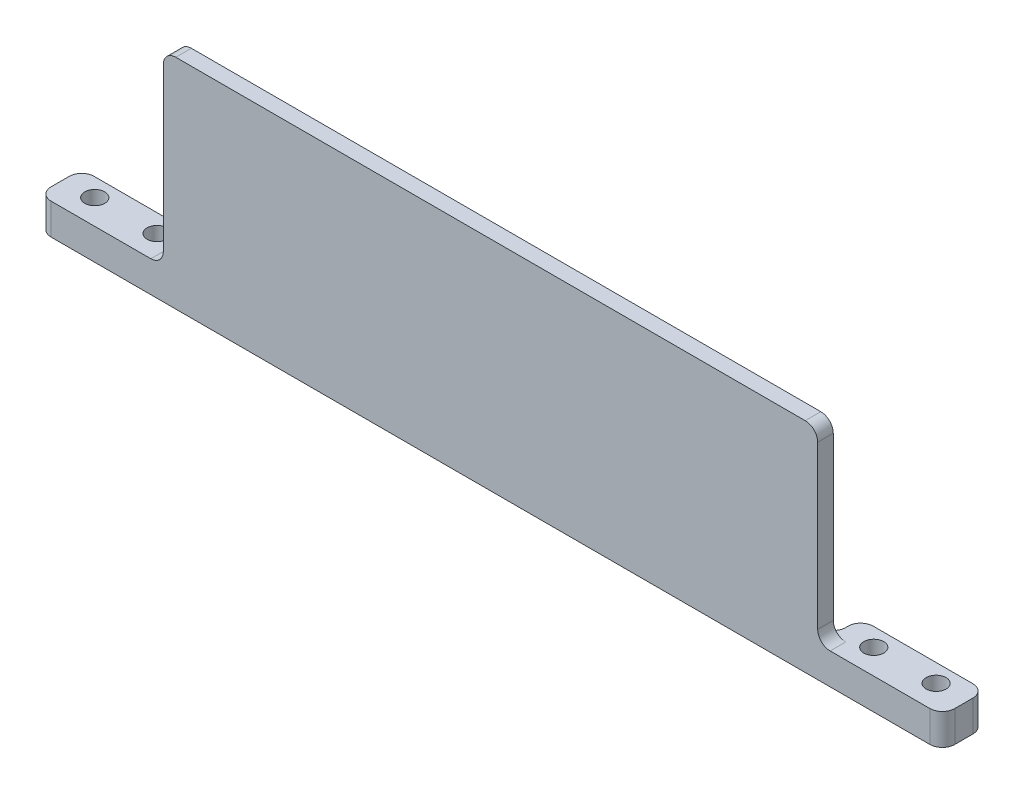
ISO-10303-21;
HEADER;
FILE_DESCRIPTION(('STEP AP214'),'2;1');
FILE_NAME('part.step','',(''),(''),'','','');
FILE_SCHEMA(('AUTOMOTIVE_DESIGN { 1 0 10303 214 1 1 1 1 }'));
ENDSEC;
DATA;
#1=APPLICATION_CONTEXT('core data for automotive mechanical design processes');
#2=APPLICATION_PROTOCOL_DEFINITION('international standard','automotive_design',2000,#1);
#3=PRODUCT_CONTEXT('',#1,'mechanical');
#4=PRODUCT('Part','Part','',(#3));
#5=PRODUCT_RELATED_PRODUCT_CATEGORY('part','',(#4));
#6=PRODUCT_DEFINITION_FORMATION('','',#4);
#7=PRODUCT_DEFINITION_CONTEXT('part definition',#1,'design');
#8=PRODUCT_DEFINITION('design','',#6,#7);
#9=PRODUCT_DEFINITION_SHAPE('','',#8);
#10=(LENGTH_UNIT() NAMED_UNIT(*) SI_UNIT(.MILLI.,.METRE.));
#11=(NAMED_UNIT(*) PLANE_ANGLE_UNIT() SI_UNIT($,.RADIAN.));
#12=(NAMED_UNIT(*) SI_UNIT($,.STERADIAN.) SOLID_ANGLE_UNIT());
#13=UNCERTAINTY_MEASURE_WITH_UNIT(LENGTH_MEASURE(1.E-05),#10,'distance_accuracy_value','');
#14=(GEOMETRIC_REPRESENTATION_CONTEXT(3) GLOBAL_UNCERTAINTY_ASSIGNED_CONTEXT((#13)) GLOBAL_UNIT_ASSIGNED_CONTEXT((#10,
#11,#12)) REPRESENTATION_CONTEXT('',''));
#15=CARTESIAN_POINT('',(0.,0.,0.));
#16=DIRECTION('',(0.,0.,1.));
#17=DIRECTION('',(1.,0.,0.));
#18=AXIS2_PLACEMENT_3D('',#15,#16,#17);
#19=CARTESIAN_POINT('',(0.,5.,0.));
#20=DIRECTION('',(0.,1.,0.));
#21=DIRECTION('',(0.,0.,1.));
#22=AXIS2_PLACEMENT_3D('',#19,#20,#21);
#23=PLANE('',#22);
#24=DIRECTION('',(-1.,0.,0.));
#25=VECTOR('',#24,1.);
#26=CARTESIAN_POINT('',(-52.5,5.,1.50000000000001));
#27=LINE('',#26,#25);
#28=CARTESIAN_POINT('',(54.5,5.,1.50000000000001));
#29=VERTEX_POINT('',#28);
#30=CARTESIAN_POINT('',(50.5,5.,1.50000000000001));
#31=VERTEX_POINT('',#30);
#32=EDGE_CURVE('E328',#29,#31,#27,.T.);
#33=ORIENTED_EDGE('',*,*,#32,.F.);
#34=DIRECTION('',(0.,0.,-1.));
#35=VECTOR('',#34,1.);
#36=CARTESIAN_POINT('',(54.5,5.,0.));
#37=LINE('',#36,#35);
#38=CARTESIAN_POINT('',(54.5,5.,4.00000000000001));
#39=VERTEX_POINT('',#38);
#40=EDGE_CURVE('E400',#29,#39,#37,.F.);
#41=ORIENTED_EDGE('',*,*,#40,.T.);
#42=DIRECTION('',(1.,0.,0.));
#43=VECTOR('',#42,1.);
#44=CARTESIAN_POINT('',(72.5,5.,4.00000000000001));
#45=LINE('',#44,#43);
#46=CARTESIAN_POINT('',(70.5,5.,4.00000000000001));
#47=VERTEX_POINT('',#46);
#48=EDGE_CURVE('E288',#39,#47,#45,.T.);
#49=ORIENTED_EDGE('',*,*,#48,.T.);
#50=CARTESIAN_POINT('',(70.5,5.,2.00000000000001));
#51=DIRECTION('',(0.,1.,0.));
#52=DIRECTION('',(0.,0.,1.));
#53=AXIS2_PLACEMENT_3D('',#50,#51,#52);
#54=CIRCLE('',#53,2.);
#55=CARTESIAN_POINT('',(72.5,5.,2.00000000000001));
#56=VERTEX_POINT('',#55);
#57=EDGE_CURVE('E357',#47,#56,#54,.T.);
#58=ORIENTED_EDGE('',*,*,#57,.T.);
#59=DIRECTION('',(0.,0.,-1.));
#60=VECTOR('',#59,1.);
#61=CARTESIAN_POINT('',(72.5,5.,4.00000000000001));
#62=LINE('',#61,#60);
#63=CARTESIAN_POINT('',(72.5,5.,-0.899999999999991));
#64=VERTEX_POINT('',#63);
#65=EDGE_CURVE('E269',#56,#64,#62,.T.);
#66=ORIENTED_EDGE('',*,*,#65,.T.);
#67=CARTESIAN_POINT('',(70.5,5.,-0.899999999999991));
#68=DIRECTION('',(0.,1.,0.));
#69=DIRECTION('',(0.,0.,1.));
#70=AXIS2_PLACEMENT_3D('',#67,#68,#69);
#71=CIRCLE('',#70,2.);
#72=CARTESIAN_POINT('',(70.5,5.,-2.89999999999999));
#73=VERTEX_POINT('',#72);
#74=EDGE_CURVE('E361',#64,#73,#71,.T.);
#75=ORIENTED_EDGE('',*,*,#74,.T.);
#76=DIRECTION('',(-1.,0.,0.));
#77=VECTOR('',#76,1.);
#78=CARTESIAN_POINT('',(72.5,5.,-2.89999999999999));
#79=LINE('',#78,#77);
#80=CARTESIAN_POINT('',(54.5,5.,-2.89999999999999));
#81=VERTEX_POINT('',#80);
#82=EDGE_CURVE('E272',#73,#81,#79,.T.);
#83=ORIENTED_EDGE('',*,*,#82,.T.);
#84=CARTESIAN_POINT('',(54.5,5.,-0.899999999999991));
#85=DIRECTION('',(0.,1.,0.));
#86=DIRECTION('',(0.,0.,1.));
#87=AXIS2_PLACEMENT_3D('',#84,#85,#86);
#88=CIRCLE('',#87,2.);
#89=CARTESIAN_POINT('',(52.5,5.,-0.899999999999991));
#90=VERTEX_POINT('',#89);
#91=EDGE_CURVE('E359',#81,#90,#88,.T.);
#92=ORIENTED_EDGE('',*,*,#91,.T.);
#93=DIRECTION('',(0.,0.,1.));
#94=VECTOR('',#93,1.);
#95=CARTESIAN_POINT('',(52.5,5.,-2.89999999999999));
#96=LINE('',#95,#94);
#97=CARTESIAN_POINT('',(52.5,5.,-0.499999999999993));
#98=VERTEX_POINT('',#97);
#99=EDGE_CURVE('E276',#90,#98,#96,.T.);
#100=ORIENTED_EDGE('',*,*,#99,.T.);
#101=CARTESIAN_POINT('',(50.5,5.,-0.499999999999993));
#102=DIRECTION('',(0.,1.,0.));
#103=DIRECTION('',(0.,0.,1.));
#104=AXIS2_PLACEMENT_3D('',#101,#102,#103);
#105=CIRCLE('',#104,2.);
#106=EDGE_CURVE('E391',#98,#31,#105,.F.);
#107=ORIENTED_EDGE('',*,*,#106,.T.);
#108=EDGE_LOOP('',(#33,#41,#49,#58,#66,#75,#83,#92,#100,#107));
#109=FACE_BOUND('',#108,.T.);
#110=CARTESIAN_POINT('',(57.5,5.,0.));
#111=DIRECTION('',(0.,1.,0.));
#112=DIRECTION('',(0.,0.,-1.));
#113=AXIS2_PLACEMENT_3D('',#110,#111,#112);
#114=CIRCLE('',#113,1.6);
#115=CARTESIAN_POINT('',(57.5,5.,-1.59999999999999));
#116=VERTEX_POINT('',#115);
#117=EDGE_CURVE('E245',#116,#116,#114,.T.);
#118=ORIENTED_EDGE('',*,*,#117,.F.);
#119=EDGE_LOOP('',(#118));
#120=FACE_BOUND('',#119,.T.);
#121=CARTESIAN_POINT('',(67.5,5.,0.));
#122=DIRECTION('',(0.,1.,0.));
#123=DIRECTION('',(0.,0.,-1.));
#124=AXIS2_PLACEMENT_3D('',#121,#122,#123);
#125=CIRCLE('',#124,1.60000000000001);
#126=CARTESIAN_POINT('',(67.5,5.,-1.6));
#127=VERTEX_POINT('',#126);
#128=EDGE_CURVE('E251',#127,#127,#125,.T.);
#129=ORIENTED_EDGE('',*,*,#128,.F.);
#130=EDGE_LOOP('',(#129));
#131=FACE_BOUND('',#130,.T.);
#132=ADVANCED_FACE('F44',(#109,#120,#131),#23,.T.);
#133=CARTESIAN_POINT('',(-70.5,5.,4.00000000000001));
#134=VERTEX_POINT('',#133);
#135=CARTESIAN_POINT('',(-54.5,5.,4.00000000000001));
#136=VERTEX_POINT('',#135);
#137=EDGE_CURVE('E226',#134,#136,#45,.T.);
#138=ORIENTED_EDGE('',*,*,#137,.T.);
#139=DIRECTION('',(0.,0.,1.));
#140=VECTOR('',#139,1.);
#141=CARTESIAN_POINT('',(-54.5,5.,0.));
#142=LINE('',#141,#140);
#143=CARTESIAN_POINT('',(-54.5,5.,1.50000000000001));
#144=VERTEX_POINT('',#143);
#145=EDGE_CURVE('E405',#136,#144,#142,.F.);
#146=ORIENTED_EDGE('',*,*,#145,.T.);
#147=DIRECTION('',(-1.,0.,0.));
#148=VECTOR('',#147,1.);
#149=CARTESIAN_POINT('',(-52.5,5.,1.50000000000001));
#150=LINE('',#149,#148);
#151=CARTESIAN_POINT('',(-50.5,5.,1.50000000000001));
#152=VERTEX_POINT('',#151);
#153=EDGE_CURVE('E58',#152,#144,#150,.T.);
#154=ORIENTED_EDGE('',*,*,#153,.F.);
#155=CARTESIAN_POINT('',(-50.5,5.,-0.499999999999993));
#156=DIRECTION('',(0.,1.,0.));
#157=DIRECTION('',(0.,0.,1.));
#158=AXIS2_PLACEMENT_3D('',#155,#156,#157);
#159=CIRCLE('',#158,2.);
#160=CARTESIAN_POINT('',(-52.5,5.,-0.499999999999993));
#161=VERTEX_POINT('',#160);
#162=EDGE_CURVE('E395',#152,#161,#159,.F.);
#163=ORIENTED_EDGE('',*,*,#162,.T.);
#164=DIRECTION('',(0.,0.,-1.));
#165=VECTOR('',#164,1.);
#166=CARTESIAN_POINT('',(-52.5,5.,-2.89999999999999));
#167=LINE('',#166,#165);
#168=CARTESIAN_POINT('',(-52.5,5.,-0.899999999999991));
#169=VERTEX_POINT('',#168);
#170=EDGE_CURVE('E279',#161,#169,#167,.T.);
#171=ORIENTED_EDGE('',*,*,#170,.T.);
#172=CARTESIAN_POINT('',(-54.5,5.,-0.899999999999991));
#173=DIRECTION('',(0.,1.,0.));
#174=DIRECTION('',(0.,0.,1.));
#175=AXIS2_PLACEMENT_3D('',#172,#173,#174);
#176=CIRCLE('',#175,2.);
#177=CARTESIAN_POINT('',(-54.5,5.,-2.89999999999999));
#178=VERTEX_POINT('',#177);
#179=EDGE_CURVE('E382',#169,#178,#176,.T.);
#180=ORIENTED_EDGE('',*,*,#179,.T.);
#181=DIRECTION('',(-1.,0.,0.));
#182=VECTOR('',#181,1.);
#183=CARTESIAN_POINT('',(-72.5,5.,-2.89999999999999));
#184=LINE('',#183,#182);
#185=CARTESIAN_POINT('',(-70.5,5.,-2.89999999999999));
#186=VERTEX_POINT('',#185);
#187=EDGE_CURVE('E282',#178,#186,#184,.T.);
#188=ORIENTED_EDGE('',*,*,#187,.T.);
#189=CARTESIAN_POINT('',(-70.5,5.,-0.899999999999991));
#190=DIRECTION('',(0.,1.,0.));
#191=DIRECTION('',(0.,0.,1.));
#192=AXIS2_PLACEMENT_3D('',#189,#190,#191);
#193=CIRCLE('',#192,2.);
#194=CARTESIAN_POINT('',(-72.5,5.,-0.899999999999991));
#195=VERTEX_POINT('',#194);
#196=EDGE_CURVE('E380',#186,#195,#193,.T.);
#197=ORIENTED_EDGE('',*,*,#196,.T.);
#198=DIRECTION('',(0.,0.,1.));
#199=VECTOR('',#198,1.);
#200=CARTESIAN_POINT('',(-72.5,5.,4.00000000000001));
#201=LINE('',#200,#199);
#202=CARTESIAN_POINT('',(-72.5,5.,2.00000000000001));
#203=VERTEX_POINT('',#202);
#204=EDGE_CURVE('E285',#195,#203,#201,.T.);
#205=ORIENTED_EDGE('',*,*,#204,.T.);
#206=CARTESIAN_POINT('',(-70.5,5.,2.00000000000001));
#207=DIRECTION('',(0.,1.,0.));
#208=DIRECTION('',(0.,0.,1.));
#209=AXIS2_PLACEMENT_3D('',#206,#207,#208);
#210=CIRCLE('',#209,2.);
#211=EDGE_CURVE('E378',#203,#134,#210,.T.);
#212=ORIENTED_EDGE('',*,*,#211,.T.);
#213=EDGE_LOOP('',(#138,#146,#154,#163,#171,#180,#188,#197,#205,#212));
#214=FACE_BOUND('',#213,.T.);
#215=CARTESIAN_POINT('',(-67.5,5.,0.));
#216=DIRECTION('',(0.,1.,0.));
#217=DIRECTION('',(0.,0.,1.));
#218=AXIS2_PLACEMENT_3D('',#215,#216,#217);
#219=CIRCLE('',#218,1.60000000000001);
#220=CARTESIAN_POINT('',(-67.5,5.,1.60000000000001));
#221=VERTEX_POINT('',#220);
#222=EDGE_CURVE('E263',#221,#221,#219,.T.);
#223=ORIENTED_EDGE('',*,*,#222,.F.);
#224=EDGE_LOOP('',(#223));
#225=FACE_BOUND('',#224,.T.);
#226=CARTESIAN_POINT('',(-57.5,5.,0.));
#227=DIRECTION('',(0.,1.,0.));
#228=DIRECTION('',(0.,0.,1.));
#229=AXIS2_PLACEMENT_3D('',#226,#227,#228);
#230=CIRCLE('',#229,1.6);
#231=CARTESIAN_POINT('',(-57.5,5.,1.6));
#232=VERTEX_POINT('',#231);
#233=EDGE_CURVE('E257',#232,#232,#230,.T.);
#234=ORIENTED_EDGE('',*,*,#233,.F.);
#235=EDGE_LOOP('',(#234));
#236=FACE_BOUND('',#235,.T.);
#237=ADVANCED_FACE('F492',(#214,#225,#236),#23,.T.);
#238=CARTESIAN_POINT('',(0.,0.,0.));
#239=DIRECTION('',(0.,1.,0.));
#240=DIRECTION('',(0.,0.,1.));
#241=AXIS2_PLACEMENT_3D('',#238,#239,#240);
#242=PLANE('',#241);
#243=DIRECTION('',(-1.,0.,0.));
#244=VECTOR('',#243,1.);
#245=CARTESIAN_POINT('',(72.5,0.,-2.89999999999999));
#246=LINE('',#245,#244);
#247=CARTESIAN_POINT('',(70.5,0.,-2.89999999999999));
#248=VERTEX_POINT('',#247);
#249=CARTESIAN_POINT('',(54.5,0.,-2.89999999999999));
#250=VERTEX_POINT('',#249);
#251=EDGE_CURVE('E292',#248,#250,#246,.T.);
#252=ORIENTED_EDGE('',*,*,#251,.F.);
#253=CARTESIAN_POINT('',(70.5,0.,-0.899999999999991));
#254=DIRECTION('',(0.,1.,0.));
#255=DIRECTION('',(0.,0.,1.));
#256=AXIS2_PLACEMENT_3D('',#253,#254,#255);
#257=CIRCLE('',#256,2.);
#258=CARTESIAN_POINT('',(72.5,0.,-0.899999999999991));
#259=VERTEX_POINT('',#258);
#260=EDGE_CURVE('E350',#248,#259,#257,.F.);
#261=ORIENTED_EDGE('',*,*,#260,.T.);
#262=DIRECTION('',(0.,0.,-1.));
#263=VECTOR('',#262,1.);
#264=CARTESIAN_POINT('',(72.5,0.,4.00000000000001));
#265=LINE('',#264,#263);
#266=CARTESIAN_POINT('',(72.5,0.,2.00000000000001));
#267=VERTEX_POINT('',#266);
#268=EDGE_CURVE('E266',#267,#259,#265,.T.);
#269=ORIENTED_EDGE('',*,*,#268,.F.);
#270=CARTESIAN_POINT('',(70.5,0.,2.00000000000001));
#271=DIRECTION('',(0.,1.,0.));
#272=DIRECTION('',(0.,0.,1.));
#273=AXIS2_PLACEMENT_3D('',#270,#271,#272);
#274=CIRCLE('',#273,2.);
#275=CARTESIAN_POINT('',(70.5,0.,4.00000000000001));
#276=VERTEX_POINT('',#275);
#277=EDGE_CURVE('E340',#267,#276,#274,.F.);
#278=ORIENTED_EDGE('',*,*,#277,.T.);
#279=DIRECTION('',(1.,0.,0.));
#280=VECTOR('',#279,1.);
#281=CARTESIAN_POINT('',(72.5,0.,4.00000000000001));
#282=LINE('',#281,#280);
#283=CARTESIAN_POINT('',(-70.5,0.,4.00000000000001));
#284=VERTEX_POINT('',#283);
#285=EDGE_CURVE('E273',#284,#276,#282,.T.);
#286=ORIENTED_EDGE('',*,*,#285,.F.);
#287=CARTESIAN_POINT('',(-70.5,0.,2.00000000000001));
#288=DIRECTION('',(0.,1.,0.));
#289=DIRECTION('',(0.,0.,1.));
#290=AXIS2_PLACEMENT_3D('',#287,#288,#289);
#291=CIRCLE('',#290,2.);
#292=CARTESIAN_POINT('',(-72.5,0.,2.00000000000001));
#293=VERTEX_POINT('',#292);
#294=EDGE_CURVE('E342',#284,#293,#291,.F.);
#295=ORIENTED_EDGE('',*,*,#294,.T.);
#296=DIRECTION('',(0.,0.,1.));
#297=VECTOR('',#296,1.);
#298=CARTESIAN_POINT('',(-72.5,0.,4.00000000000001));
#299=LINE('',#298,#297);
#300=CARTESIAN_POINT('',(-72.5,0.,-0.899999999999991));
#301=VERTEX_POINT('',#300);
#302=EDGE_CURVE('E307',#301,#293,#299,.T.);
#303=ORIENTED_EDGE('',*,*,#302,.F.);
#304=CARTESIAN_POINT('',(-70.5,0.,-0.899999999999991));
#305=DIRECTION('',(0.,1.,0.));
#306=DIRECTION('',(0.,0.,1.));
#307=AXIS2_PLACEMENT_3D('',#304,#305,#306);
#308=CIRCLE('',#307,2.);
#309=CARTESIAN_POINT('',(-70.5,0.,-2.89999999999999));
#310=VERTEX_POINT('',#309);
#311=EDGE_CURVE('E344',#301,#310,#308,.F.);
#312=ORIENTED_EDGE('',*,*,#311,.T.);
#313=DIRECTION('',(-1.,0.,0.));
#314=VECTOR('',#313,1.);
#315=CARTESIAN_POINT('',(-72.5,0.,-2.89999999999999));
#316=LINE('',#315,#314);
#317=CARTESIAN_POINT('',(-54.5,0.,-2.89999999999999));
#318=VERTEX_POINT('',#317);
#319=EDGE_CURVE('E304',#318,#310,#316,.T.);
#320=ORIENTED_EDGE('',*,*,#319,.F.);
#321=CARTESIAN_POINT('',(-54.5,0.,-0.899999999999991));
#322=DIRECTION('',(0.,1.,0.));
#323=DIRECTION('',(0.,0.,1.));
#324=AXIS2_PLACEMENT_3D('',#321,#322,#323);
#325=CIRCLE('',#324,2.);
#326=CARTESIAN_POINT('',(-52.5,0.,-0.899999999999991));
#327=VERTEX_POINT('',#326);
#328=EDGE_CURVE('E346',#318,#327,#325,.F.);
#329=ORIENTED_EDGE('',*,*,#328,.T.);
#330=DIRECTION('',(0.,0.,-1.));
#331=VECTOR('',#330,1.);
#332=CARTESIAN_POINT('',(-52.5,0.,-2.89999999999999));
#333=LINE('',#332,#331);
#334=CARTESIAN_POINT('',(-52.5,0.,-0.499999999999993));
#335=VERTEX_POINT('',#334);
#336=EDGE_CURVE('E301',#335,#327,#333,.T.);
#337=ORIENTED_EDGE('',*,*,#336,.F.);
#338=CARTESIAN_POINT('',(-50.5,0.,-0.499999999999993));
#339=DIRECTION('',(0.,1.,0.));
#340=DIRECTION('',(0.,0.,1.));
#341=AXIS2_PLACEMENT_3D('',#338,#339,#340);
#342=CIRCLE('',#341,2.);
#343=CARTESIAN_POINT('',(-50.5,0.,1.50000000000001));
#344=VERTEX_POINT('',#343);
#345=EDGE_CURVE('E393',#335,#344,#342,.T.);
#346=ORIENTED_EDGE('',*,*,#345,.T.);
#347=DIRECTION('',(-1.,0.,0.));
#348=VECTOR('',#347,1.);
#349=CARTESIAN_POINT('',(-52.5,0.,1.50000000000001));
#350=LINE('',#349,#348);
#351=CARTESIAN_POINT('',(50.5,0.,1.50000000000001));
#352=VERTEX_POINT('',#351);
#353=EDGE_CURVE('E298',#352,#344,#350,.T.);
#354=ORIENTED_EDGE('',*,*,#353,.F.);
#355=CARTESIAN_POINT('',(50.5,0.,-0.499999999999993));
#356=DIRECTION('',(0.,1.,0.));
#357=DIRECTION('',(0.,0.,1.));
#358=AXIS2_PLACEMENT_3D('',#355,#356,#357);
#359=CIRCLE('',#358,2.);
#360=CARTESIAN_POINT('',(52.5,0.,-0.499999999999993));
#361=VERTEX_POINT('',#360);
#362=EDGE_CURVE('E389',#352,#361,#359,.T.);
#363=ORIENTED_EDGE('',*,*,#362,.T.);
#364=DIRECTION('',(0.,0.,1.));
#365=VECTOR('',#364,1.);
#366=CARTESIAN_POINT('',(52.5,0.,-2.89999999999999));
#367=LINE('',#366,#365);
#368=CARTESIAN_POINT('',(52.5,0.,-0.899999999999991));
#369=VERTEX_POINT('',#368);
#370=EDGE_CURVE('E295',#369,#361,#367,.T.);
#371=ORIENTED_EDGE('',*,*,#370,.F.);
#372=CARTESIAN_POINT('',(54.5,0.,-0.899999999999991));
#373=DIRECTION('',(0.,1.,0.));
#374=DIRECTION('',(0.,0.,1.));
#375=AXIS2_PLACEMENT_3D('',#372,#373,#374);
#376=CIRCLE('',#375,2.);
#377=EDGE_CURVE('E348',#369,#250,#376,.F.);
#378=ORIENTED_EDGE('',*,*,#377,.T.);
#379=EDGE_LOOP('',(#252,#261,#269,#278,#286,#295,#303,#312,#320,#329,#337,#346,#354,#363,#371,#378));
#380=FACE_BOUND('',#379,.T.);
#381=CARTESIAN_POINT('',(-67.5,0.,0.));
#382=DIRECTION('',(0.,1.,0.));
#383=DIRECTION('',(0.,0.,1.));
#384=AXIS2_PLACEMENT_3D('',#381,#382,#383);
#385=CIRCLE('',#384,1.60000000000001);
#386=CARTESIAN_POINT('',(-67.5,0.,1.60000000000001));
#387=VERTEX_POINT('',#386);
#388=EDGE_CURVE('E260',#387,#387,#385,.T.);
#389=ORIENTED_EDGE('',*,*,#388,.T.);
#390=EDGE_LOOP('',(#389));
#391=FACE_BOUND('',#390,.T.);
#392=CARTESIAN_POINT('',(-57.5,0.,0.));
#393=DIRECTION('',(0.,1.,0.));
#394=DIRECTION('',(0.,0.,1.));
#395=AXIS2_PLACEMENT_3D('',#392,#393,#394);
#396=CIRCLE('',#395,1.6);
#397=CARTESIAN_POINT('',(-57.5,0.,1.6));
#398=VERTEX_POINT('',#397);
#399=EDGE_CURVE('E254',#398,#398,#396,.T.);
#400=ORIENTED_EDGE('',*,*,#399,.T.);
#401=EDGE_LOOP('',(#400));
#402=FACE_BOUND('',#401,.T.);
#403=CARTESIAN_POINT('',(67.5,0.,0.));
#404=DIRECTION('',(0.,1.,0.));
#405=DIRECTION('',(0.,0.,-1.));
#406=AXIS2_PLACEMENT_3D('',#403,#404,#405);
#407=CIRCLE('',#406,1.60000000000001);
#408=CARTESIAN_POINT('',(67.5,0.,-1.6));
#409=VERTEX_POINT('',#408);
#410=EDGE_CURVE('E248',#409,#409,#407,.T.);
#411=ORIENTED_EDGE('',*,*,#410,.T.);
#412=EDGE_LOOP('',(#411));
#413=FACE_BOUND('',#412,.T.);
#414=CARTESIAN_POINT('',(57.5,0.,0.));
#415=DIRECTION('',(0.,1.,0.));
#416=DIRECTION('',(0.,0.,-1.));
#417=AXIS2_PLACEMENT_3D('',#414,#415,#416);
#418=CIRCLE('',#417,1.6);
#419=CARTESIAN_POINT('',(57.5,0.,-1.59999999999999));
#420=VERTEX_POINT('',#419);
#421=EDGE_CURVE('E244',#420,#420,#418,.T.);
#422=ORIENTED_EDGE('',*,*,#421,.T.);
#423=EDGE_LOOP('',(#422));
#424=FACE_BOUND('',#423,.T.);
#425=ADVANCED_FACE('F431',(#380,#391,#402,#413,#424),#242,.F.);
#426=CARTESIAN_POINT('',(72.5,5.,4.00000000000001));
#427=DIRECTION('',(-1.,0.,0.));
#428=DIRECTION('',(0.,0.,1.));
#429=AXIS2_PLACEMENT_3D('',#426,#427,#428);
#430=PLANE('',#429);
#431=ORIENTED_EDGE('',*,*,#268,.T.);
#432=DIRECTION('',(0.,-1.,0.));
#433=VECTOR('',#432,1.);
#434=CARTESIAN_POINT('',(72.5,5.,-0.899999999999991));
#435=LINE('',#434,#433);
#436=EDGE_CURVE('E355',#259,#64,#435,.F.);
#437=ORIENTED_EDGE('',*,*,#436,.T.);
#438=ORIENTED_EDGE('',*,*,#65,.F.);
#439=DIRECTION('',(0.,-1.,0.));
#440=VECTOR('',#439,1.);
#441=CARTESIAN_POINT('',(72.5,5.,2.00000000000001));
#442=LINE('',#441,#440);
#443=EDGE_CURVE('E352',#56,#267,#442,.T.);
#444=ORIENTED_EDGE('',*,*,#443,.T.);
#445=EDGE_LOOP('',(#431,#437,#438,#444));
#446=FACE_BOUND('',#445,.T.);
#447=ADVANCED_FACE('F451',(#446),#430,.F.);
#448=CARTESIAN_POINT('',(72.5,5.,-2.89999999999999));
#449=DIRECTION('',(0.,0.,1.));
#450=DIRECTION('',(1.,0.,0.));
#451=AXIS2_PLACEMENT_3D('',#448,#449,#450);
#452=PLANE('',#451);
#453=ORIENTED_EDGE('',*,*,#82,.F.);
#454=DIRECTION('',(0.,-1.,0.));
#455=VECTOR('',#454,1.);
#456=CARTESIAN_POINT('',(70.5,5.,-2.89999999999999));
#457=LINE('',#456,#455);
#458=EDGE_CURVE('E337',#73,#248,#457,.T.);
#459=ORIENTED_EDGE('',*,*,#458,.T.);
#460=ORIENTED_EDGE('',*,*,#251,.T.);
#461=DIRECTION('',(0.,-1.,0.));
#462=VECTOR('',#461,1.);
#463=CARTESIAN_POINT('',(54.5,5.,-2.89999999999999));
#464=LINE('',#463,#462);
#465=EDGE_CURVE('E335',#250,#81,#464,.F.);
#466=ORIENTED_EDGE('',*,*,#465,.T.);
#467=EDGE_LOOP('',(#453,#459,#460,#466));
#468=FACE_BOUND('',#467,.T.);
#469=ADVANCED_FACE('F443',(#468),#452,.F.);
#470=CARTESIAN_POINT('',(52.5,5.,-2.89999999999999));
#471=DIRECTION('',(1.,0.,0.));
#472=DIRECTION('',(0.,0.,-1.));
#473=AXIS2_PLACEMENT_3D('',#470,#471,#472);
#474=PLANE('',#473);
#475=ORIENTED_EDGE('',*,*,#99,.F.);
#476=DIRECTION('',(0.,-1.,0.));
#477=VECTOR('',#476,1.);
#478=CARTESIAN_POINT('',(52.5,5.,-0.899999999999991));
#479=LINE('',#478,#477);
#480=EDGE_CURVE('E365',#90,#369,#479,.T.);
#481=ORIENTED_EDGE('',*,*,#480,.T.);
#482=ORIENTED_EDGE('',*,*,#370,.T.);
#483=DIRECTION('',(0.,-1.,0.));
#484=VECTOR('',#483,1.);
#485=CARTESIAN_POINT('',(52.5,5.,-0.499999999999993));
#486=LINE('',#485,#484);
#487=EDGE_CURVE('E363',#361,#98,#486,.F.);
#488=ORIENTED_EDGE('',*,*,#487,.T.);
#489=EDGE_LOOP('',(#475,#481,#482,#488));
#490=FACE_BOUND('',#489,.T.);
#491=ADVANCED_FACE('F435',(#490),#474,.F.);
#492=CARTESIAN_POINT('',(-52.5,5.,1.50000000000001));
#493=DIRECTION('',(0.,0.,1.));
#494=DIRECTION('',(1.,0.,0.));
#495=AXIS2_PLACEMENT_3D('',#492,#493,#494);
#496=PLANE('',#495);
#497=DIRECTION('',(0.,-1.,0.));
#498=VECTOR('',#497,1.);
#499=CARTESIAN_POINT('',(-52.5,35.,1.50000000000001));
#500=LINE('',#499,#498);
#501=CARTESIAN_POINT('',(-52.5,33.,1.50000000000001));
#502=VERTEX_POINT('',#501);
#503=CARTESIAN_POINT('',(-52.5,7.,1.50000000000001));
#504=VERTEX_POINT('',#503);
#505=EDGE_CURVE('E241',#502,#504,#500,.T.);
#506=ORIENTED_EDGE('',*,*,#505,.F.);
#507=CARTESIAN_POINT('',(-50.5,33.,1.50000000000001));
#508=DIRECTION('',(0.,0.,1.));
#509=DIRECTION('',(1.,0.,0.));
#510=AXIS2_PLACEMENT_3D('',#507,#508,#509);
#511=CIRCLE('',#510,2.);
#512=CARTESIAN_POINT('',(-50.5,35.,1.50000000000001));
#513=VERTEX_POINT('',#512);
#514=EDGE_CURVE('E213',#502,#513,#511,.F.);
#515=ORIENTED_EDGE('',*,*,#514,.T.);
#516=DIRECTION('',(-1.,0.,0.));
#517=VECTOR('',#516,1.);
#518=CARTESIAN_POINT('',(52.5,35.,1.50000000000001));
#519=LINE('',#518,#517);
#520=CARTESIAN_POINT('',(50.5,35.,1.50000000000001));
#521=VERTEX_POINT('',#520);
#522=EDGE_CURVE('E221',#521,#513,#519,.T.);
#523=ORIENTED_EDGE('',*,*,#522,.F.);
#524=CARTESIAN_POINT('',(50.5,33.,1.50000000000001));
#525=DIRECTION('',(0.,0.,1.));
#526=DIRECTION('',(1.,0.,0.));
#527=AXIS2_PLACEMENT_3D('',#524,#525,#526);
#528=CIRCLE('',#527,2.);
#529=CARTESIAN_POINT('',(52.5,33.,1.50000000000001));
#530=VERTEX_POINT('',#529);
#531=EDGE_CURVE('E204',#521,#530,#528,.F.);
#532=ORIENTED_EDGE('',*,*,#531,.T.);
#533=DIRECTION('',(0.,-1.,0.));
#534=VECTOR('',#533,1.);
#535=CARTESIAN_POINT('',(52.5,35.,1.50000000000001));
#536=LINE('',#535,#534);
#537=CARTESIAN_POINT('',(52.5,7.,1.50000000000001));
#538=VERTEX_POINT('',#537);
#539=EDGE_CURVE('E232',#530,#538,#536,.T.);
#540=ORIENTED_EDGE('',*,*,#539,.T.);
#541=CARTESIAN_POINT('',(54.5,7.,1.50000000000001));
#542=DIRECTION('',(0.,0.,1.));
#543=DIRECTION('',(1.,0.,0.));
#544=AXIS2_PLACEMENT_3D('',#541,#542,#543);
#545=CIRCLE('',#544,2.);
#546=EDGE_CURVE('E407',#538,#29,#545,.T.);
#547=ORIENTED_EDGE('',*,*,#546,.T.);
#548=ORIENTED_EDGE('',*,*,#32,.T.);
#549=DIRECTION('',(0.,-1.,0.));
#550=VECTOR('',#549,1.);
#551=CARTESIAN_POINT('',(50.5,0.,1.50000000000001));
#552=LINE('',#551,#550);
#553=EDGE_CURVE('E214',#31,#352,#552,.T.);
#554=ORIENTED_EDGE('',*,*,#553,.T.);
#555=ORIENTED_EDGE('',*,*,#353,.T.);
#556=DIRECTION('',(0.,-1.,0.));
#557=VECTOR('',#556,1.);
#558=CARTESIAN_POINT('',(-50.5,5.,1.50000000000001));
#559=LINE('',#558,#557);
#560=EDGE_CURVE('E326',#344,#152,#559,.F.);
#561=ORIENTED_EDGE('',*,*,#560,.T.);
#562=ORIENTED_EDGE('',*,*,#153,.T.);
#563=CARTESIAN_POINT('',(-54.5,7.,1.50000000000001));
#564=DIRECTION('',(0.,0.,1.));
#565=DIRECTION('',(1.,0.,0.));
#566=AXIS2_PLACEMENT_3D('',#563,#564,#565);
#567=CIRCLE('',#566,2.);
#568=EDGE_CURVE('E11',#144,#504,#567,.T.);
#569=ORIENTED_EDGE('',*,*,#568,.T.);
#570=EDGE_LOOP('',(#506,#515,#523,#532,#540,#547,#548,#554,#555,#561,#562,#569));
#571=FACE_BOUND('',#570,.T.);
#572=ADVANCED_FACE('F229',(#571),#496,.F.);
#573=CARTESIAN_POINT('',(-52.5,5.,-2.89999999999999));
#574=DIRECTION('',(-1.,0.,0.));
#575=DIRECTION('',(0.,0.,1.));
#576=AXIS2_PLACEMENT_3D('',#573,#574,#575);
#577=PLANE('',#576);
#578=ORIENTED_EDGE('',*,*,#170,.F.);
#579=DIRECTION('',(0.,-1.,0.));
#580=VECTOR('',#579,1.);
#581=CARTESIAN_POINT('',(-52.5,0.,-0.499999999999993));
#582=LINE('',#581,#580);
#583=EDGE_CURVE('E370',#161,#335,#582,.T.);
#584=ORIENTED_EDGE('',*,*,#583,.T.);
#585=ORIENTED_EDGE('',*,*,#336,.T.);
#586=DIRECTION('',(0.,-1.,0.));
#587=VECTOR('',#586,1.);
#588=CARTESIAN_POINT('',(-52.5,5.,-0.899999999999991));
#589=LINE('',#588,#587);
#590=EDGE_CURVE('E368',#327,#169,#589,.F.);
#591=ORIENTED_EDGE('',*,*,#590,.T.);
#592=EDGE_LOOP('',(#578,#584,#585,#591));
#593=FACE_BOUND('',#592,.T.);
#594=ADVANCED_FACE('F485',(#593),#577,.F.);
#595=CARTESIAN_POINT('',(-72.5,5.,-2.89999999999999));
#596=DIRECTION('',(0.,0.,1.));
#597=DIRECTION('',(1.,0.,0.));
#598=AXIS2_PLACEMENT_3D('',#595,#596,#597);
#599=PLANE('',#598);
#600=ORIENTED_EDGE('',*,*,#187,.F.);
#601=DIRECTION('',(0.,-1.,0.));
#602=VECTOR('',#601,1.);
#603=CARTESIAN_POINT('',(-54.5,5.,-2.89999999999999));
#604=LINE('',#603,#602);
#605=EDGE_CURVE('E375',#178,#318,#604,.T.);
#606=ORIENTED_EDGE('',*,*,#605,.T.);
#607=ORIENTED_EDGE('',*,*,#319,.T.);
#608=DIRECTION('',(0.,-1.,0.));
#609=VECTOR('',#608,1.);
#610=CARTESIAN_POINT('',(-70.5,5.,-2.89999999999999));
#611=LINE('',#610,#609);
#612=EDGE_CURVE('E373',#310,#186,#611,.F.);
#613=ORIENTED_EDGE('',*,*,#612,.T.);
#614=EDGE_LOOP('',(#600,#606,#607,#613));
#615=FACE_BOUND('',#614,.T.);
#616=ADVANCED_FACE('F476',(#615),#599,.F.);
#617=CARTESIAN_POINT('',(-72.5,5.,4.00000000000001));
#618=DIRECTION('',(1.,0.,0.));
#619=DIRECTION('',(0.,0.,-1.));
#620=AXIS2_PLACEMENT_3D('',#617,#618,#619);
#621=PLANE('',#620);
#622=ORIENTED_EDGE('',*,*,#204,.F.);
#623=DIRECTION('',(0.,-1.,0.));
#624=VECTOR('',#623,1.);
#625=CARTESIAN_POINT('',(-72.5,5.,-0.899999999999991));
#626=LINE('',#625,#624);
#627=EDGE_CURVE('E386',#195,#301,#626,.T.);
#628=ORIENTED_EDGE('',*,*,#627,.T.);
#629=ORIENTED_EDGE('',*,*,#302,.T.);
#630=DIRECTION('',(0.,-1.,0.));
#631=VECTOR('',#630,1.);
#632=CARTESIAN_POINT('',(-72.5,5.,2.00000000000001));
#633=LINE('',#632,#631);
#634=EDGE_CURVE('E384',#293,#203,#633,.F.);
#635=ORIENTED_EDGE('',*,*,#634,.T.);
#636=EDGE_LOOP('',(#622,#628,#629,#635));
#637=FACE_BOUND('',#636,.T.);
#638=ADVANCED_FACE('F467',(#637),#621,.F.);
#639=CARTESIAN_POINT('',(72.5,5.,4.00000000000001));
#640=DIRECTION('',(0.,0.,-1.));
#641=DIRECTION('',(-1.,0.,0.));
#642=AXIS2_PLACEMENT_3D('',#639,#640,#641);
#643=PLANE('',#642);
#644=DIRECTION('',(1.,0.,0.));
#645=VECTOR('',#644,1.);
#646=CARTESIAN_POINT('',(-52.5,35.,4.00000000000001));
#647=LINE('',#646,#645);
#648=CARTESIAN_POINT('',(-50.5,35.,4.00000000000001));
#649=VERTEX_POINT('',#648);
#650=CARTESIAN_POINT('',(50.5,35.,4.00000000000001));
#651=VERTEX_POINT('',#650);
#652=EDGE_CURVE('E224',#649,#651,#647,.T.);
#653=ORIENTED_EDGE('',*,*,#652,.F.);
#654=CARTESIAN_POINT('',(-50.5,33.,4.00000000000001));
#655=DIRECTION('',(0.,0.,-1.));
#656=DIRECTION('',(-1.,0.,0.));
#657=AXIS2_PLACEMENT_3D('',#654,#655,#656);
#658=CIRCLE('',#657,2.);
#659=CARTESIAN_POINT('',(-52.5,33.,4.00000000000001));
#660=VERTEX_POINT('',#659);
#661=EDGE_CURVE('E321',#649,#660,#658,.F.);
#662=ORIENTED_EDGE('',*,*,#661,.T.);
#663=DIRECTION('',(0.,-1.,0.));
#664=VECTOR('',#663,1.);
#665=CARTESIAN_POINT('',(-52.5,35.,4.00000000000001));
#666=LINE('',#665,#664);
#667=CARTESIAN_POINT('',(-52.5,7.,4.00000000000001));
#668=VERTEX_POINT('',#667);
#669=EDGE_CURVE('E239',#660,#668,#666,.T.);
#670=ORIENTED_EDGE('',*,*,#669,.T.);
#671=CARTESIAN_POINT('',(-54.5,7.,4.00000000000001));
#672=DIRECTION('',(0.,0.,-1.));
#673=DIRECTION('',(-1.,0.,0.));
#674=AXIS2_PLACEMENT_3D('',#671,#672,#673);
#675=CIRCLE('',#674,2.);
#676=EDGE_CURVE('E52',#668,#136,#675,.T.);
#677=ORIENTED_EDGE('',*,*,#676,.T.);
#678=ORIENTED_EDGE('',*,*,#137,.F.);
#679=DIRECTION('',(0.,-1.,0.));
#680=VECTOR('',#679,1.);
#681=CARTESIAN_POINT('',(-70.5,5.,4.00000000000001));
#682=LINE('',#681,#680);
#683=EDGE_CURVE('E316',#134,#284,#682,.T.);
#684=ORIENTED_EDGE('',*,*,#683,.T.);
#685=ORIENTED_EDGE('',*,*,#285,.T.);
#686=DIRECTION('',(0.,-1.,0.));
#687=VECTOR('',#686,1.);
#688=CARTESIAN_POINT('',(70.5,5.,4.00000000000001));
#689=LINE('',#688,#687);
#690=EDGE_CURVE('E313',#276,#47,#689,.F.);
#691=ORIENTED_EDGE('',*,*,#690,.T.);
#692=ORIENTED_EDGE('',*,*,#48,.F.);
#693=CARTESIAN_POINT('',(54.5,7.,4.00000000000001));
#694=DIRECTION('',(0.,0.,-1.));
#695=DIRECTION('',(-1.,0.,0.));
#696=AXIS2_PLACEMENT_3D('',#693,#694,#695);
#697=CIRCLE('',#696,2.);
#698=CARTESIAN_POINT('',(52.5,7.,4.00000000000001));
#699=VERTEX_POINT('',#698);
#700=EDGE_CURVE('E410',#39,#699,#697,.T.);
#701=ORIENTED_EDGE('',*,*,#700,.T.);
#702=DIRECTION('',(0.,-1.,0.));
#703=VECTOR('',#702,1.);
#704=CARTESIAN_POINT('',(52.5,35.,4.00000000000001));
#705=LINE('',#704,#703);
#706=CARTESIAN_POINT('',(52.5,33.,4.00000000000001));
#707=VERTEX_POINT('',#706);
#708=EDGE_CURVE('E236',#707,#699,#705,.T.);
#709=ORIENTED_EDGE('',*,*,#708,.F.);
#710=CARTESIAN_POINT('',(50.5,33.,4.00000000000001));
#711=DIRECTION('',(0.,0.,-1.));
#712=DIRECTION('',(-1.,0.,0.));
#713=AXIS2_PLACEMENT_3D('',#710,#711,#712);
#714=CIRCLE('',#713,2.);
#715=EDGE_CURVE('E319',#707,#651,#714,.F.);
#716=ORIENTED_EDGE('',*,*,#715,.T.);
#717=EDGE_LOOP('',(#653,#662,#670,#677,#678,#684,#685,#691,#692,#701,#709,#716));
#718=FACE_BOUND('',#717,.T.);
#719=ADVANCED_FACE('F414',(#718),#643,.F.);
#720=CARTESIAN_POINT('',(-67.5,5.,0.));
#721=DIRECTION('',(0.,-1.,0.));
#722=DIRECTION('',(0.,0.,-1.));
#723=AXIS2_PLACEMENT_3D('',#720,#721,#722);
#724=CYLINDRICAL_SURFACE('',#723,1.60000000000001);
#725=ORIENTED_EDGE('',*,*,#222,.T.);
#726=EDGE_LOOP('',(#725));
#727=FACE_BOUND('',#726,.T.);
#728=ORIENTED_EDGE('',*,*,#388,.F.);
#729=EDGE_LOOP('',(#728));
#730=FACE_BOUND('',#729,.T.);
#731=ADVANCED_FACE('F521',(#727,#730),#724,.F.);
#732=CARTESIAN_POINT('',(-57.5,5.,0.));
#733=DIRECTION('',(0.,-1.,0.));
#734=DIRECTION('',(0.,0.,-1.));
#735=AXIS2_PLACEMENT_3D('',#732,#733,#734);
#736=CYLINDRICAL_SURFACE('',#735,1.6);
#737=ORIENTED_EDGE('',*,*,#233,.T.);
#738=EDGE_LOOP('',(#737));
#739=FACE_BOUND('',#738,.T.);
#740=ORIENTED_EDGE('',*,*,#399,.F.);
#741=EDGE_LOOP('',(#740));
#742=FACE_BOUND('',#741,.T.);
#743=ADVANCED_FACE('F580',(#739,#742),#736,.F.);
#744=CARTESIAN_POINT('',(67.5,5.,0.));
#745=DIRECTION('',(0.,-1.,0.));
#746=DIRECTION('',(0.,0.,-1.));
#747=AXIS2_PLACEMENT_3D('',#744,#745,#746);
#748=CYLINDRICAL_SURFACE('',#747,1.60000000000001);
#749=ORIENTED_EDGE('',*,*,#128,.T.);
#750=EDGE_LOOP('',(#749));
#751=FACE_BOUND('',#750,.T.);
#752=ORIENTED_EDGE('',*,*,#410,.F.);
#753=EDGE_LOOP('',(#752));
#754=FACE_BOUND('',#753,.T.);
#755=ADVANCED_FACE('F587',(#751,#754),#748,.F.);
#756=CARTESIAN_POINT('',(57.5,5.,0.));
#757=DIRECTION('',(0.,-1.,0.));
#758=DIRECTION('',(0.,0.,-1.));
#759=AXIS2_PLACEMENT_3D('',#756,#757,#758);
#760=CYLINDRICAL_SURFACE('',#759,1.6);
#761=ORIENTED_EDGE('',*,*,#117,.T.);
#762=EDGE_LOOP('',(#761));
#763=FACE_BOUND('',#762,.T.);
#764=ORIENTED_EDGE('',*,*,#421,.F.);
#765=EDGE_LOOP('',(#764));
#766=FACE_BOUND('',#765,.T.);
#767=ADVANCED_FACE('F594',(#763,#766),#760,.F.);
#768=CARTESIAN_POINT('',(-52.5,35.,1.50000000000001));
#769=DIRECTION('',(1.,0.,0.));
#770=DIRECTION('',(0.,0.,-1.));
#771=AXIS2_PLACEMENT_3D('',#768,#769,#770);
#772=PLANE('',#771);
#773=ORIENTED_EDGE('',*,*,#505,.T.);
#774=DIRECTION('',(0.,0.,1.));
#775=VECTOR('',#774,1.);
#776=CARTESIAN_POINT('',(-52.5,7.,1.50000000000001));
#777=LINE('',#776,#775);
#778=EDGE_CURVE('E402',#504,#668,#777,.T.);
#779=ORIENTED_EDGE('',*,*,#778,.T.);
#780=ORIENTED_EDGE('',*,*,#669,.F.);
#781=DIRECTION('',(0.,0.,1.));
#782=VECTOR('',#781,1.);
#783=CARTESIAN_POINT('',(-52.5,33.,1.50000000000001));
#784=LINE('',#783,#782);
#785=EDGE_CURVE('E323',#660,#502,#784,.F.);
#786=ORIENTED_EDGE('',*,*,#785,.T.);
#787=EDGE_LOOP('',(#773,#779,#780,#786));
#788=FACE_BOUND('',#787,.T.);
#789=ADVANCED_FACE('F499',(#788),#772,.F.);
#790=CARTESIAN_POINT('',(52.5,35.,4.00000000000001));
#791=DIRECTION('',(-1.,0.,0.));
#792=DIRECTION('',(0.,0.,1.));
#793=AXIS2_PLACEMENT_3D('',#790,#791,#792);
#794=PLANE('',#793);
#795=ORIENTED_EDGE('',*,*,#708,.T.);
#796=DIRECTION('',(0.,0.,-1.));
#797=VECTOR('',#796,1.);
#798=CARTESIAN_POINT('',(52.5,7.,4.00000000000001));
#799=LINE('',#798,#797);
#800=EDGE_CURVE('E397',#699,#538,#799,.T.);
#801=ORIENTED_EDGE('',*,*,#800,.T.);
#802=ORIENTED_EDGE('',*,*,#539,.F.);
#803=DIRECTION('',(0.,0.,-1.));
#804=VECTOR('',#803,1.);
#805=CARTESIAN_POINT('',(52.5,33.,4.00000000000001));
#806=LINE('',#805,#804);
#807=EDGE_CURVE('E209',#530,#707,#806,.F.);
#808=ORIENTED_EDGE('',*,*,#807,.T.);
#809=EDGE_LOOP('',(#795,#801,#802,#808));
#810=FACE_BOUND('',#809,.T.);
#811=ADVANCED_FACE('F419',(#810),#794,.F.);
#812=CARTESIAN_POINT('',(0.,35.,0.));
#813=DIRECTION('',(0.,1.,0.));
#814=DIRECTION('',(0.,0.,1.));
#815=AXIS2_PLACEMENT_3D('',#812,#813,#814);
#816=PLANE('',#815);
#817=ORIENTED_EDGE('',*,*,#522,.T.);
#818=DIRECTION('',(0.,0.,1.));
#819=VECTOR('',#818,1.);
#820=CARTESIAN_POINT('',(-50.5,35.,4.00000000000001));
#821=LINE('',#820,#819);
#822=EDGE_CURVE('E225',#513,#649,#821,.T.);
#823=ORIENTED_EDGE('',*,*,#822,.T.);
#824=ORIENTED_EDGE('',*,*,#652,.T.);
#825=DIRECTION('',(0.,0.,-1.));
#826=VECTOR('',#825,1.);
#827=CARTESIAN_POINT('',(50.5,35.,1.50000000000001));
#828=LINE('',#827,#826);
#829=EDGE_CURVE('E208',#651,#521,#828,.T.);
#830=ORIENTED_EDGE('',*,*,#829,.T.);
#831=EDGE_LOOP('',(#817,#823,#824,#830));
#832=FACE_BOUND('',#831,.T.);
#833=ADVANCED_FACE('F219',(#832),#816,.T.);
#834=CARTESIAN_POINT('',(-50.5,33.,0.));
#835=DIRECTION('',(0.,0.,-1.));
#836=DIRECTION('',(-1.,0.,0.));
#837=AXIS2_PLACEMENT_3D('',#834,#835,#836);
#838=CYLINDRICAL_SURFACE('',#837,2.);
#839=ORIENTED_EDGE('',*,*,#514,.F.);
#840=ORIENTED_EDGE('',*,*,#785,.F.);
#841=ORIENTED_EDGE('',*,*,#661,.F.);
#842=ORIENTED_EDGE('',*,*,#822,.F.);
#843=EDGE_LOOP('',(#839,#840,#841,#842));
#844=FACE_BOUND('',#843,.T.);
#845=ADVANCED_FACE('F503',(#844),#838,.T.);
#846=CARTESIAN_POINT('',(50.5,33.,0.));
#847=DIRECTION('',(0.,0.,1.));
#848=DIRECTION('',(1.,0.,0.));
#849=AXIS2_PLACEMENT_3D('',#846,#847,#848);
#850=CYLINDRICAL_SURFACE('',#849,2.);
#851=ORIENTED_EDGE('',*,*,#715,.F.);
#852=ORIENTED_EDGE('',*,*,#807,.F.);
#853=ORIENTED_EDGE('',*,*,#531,.F.);
#854=ORIENTED_EDGE('',*,*,#829,.F.);
#855=EDGE_LOOP('',(#851,#852,#853,#854));
#856=FACE_BOUND('',#855,.T.);
#857=ADVANCED_FACE('F207',(#856),#850,.T.);
#858=CARTESIAN_POINT('',(70.5,5.,-0.899999999999991));
#859=DIRECTION('',(0.,-1.,0.));
#860=DIRECTION('',(0.,0.,-1.));
#861=AXIS2_PLACEMENT_3D('',#858,#859,#860);
#862=CYLINDRICAL_SURFACE('',#861,2.);
#863=ORIENTED_EDGE('',*,*,#74,.F.);
#864=ORIENTED_EDGE('',*,*,#436,.F.);
#865=ORIENTED_EDGE('',*,*,#260,.F.);
#866=ORIENTED_EDGE('',*,*,#458,.F.);
#867=EDGE_LOOP('',(#863,#864,#865,#866));
#868=FACE_BOUND('',#867,.T.);
#869=ADVANCED_FACE('F447',(#868),#862,.T.);
#870=CARTESIAN_POINT('',(54.5,5.,-0.899999999999991));
#871=DIRECTION('',(0.,-1.,0.));
#872=DIRECTION('',(0.,0.,-1.));
#873=AXIS2_PLACEMENT_3D('',#870,#871,#872);
#874=CYLINDRICAL_SURFACE('',#873,2.);
#875=ORIENTED_EDGE('',*,*,#91,.F.);
#876=ORIENTED_EDGE('',*,*,#465,.F.);
#877=ORIENTED_EDGE('',*,*,#377,.F.);
#878=ORIENTED_EDGE('',*,*,#480,.F.);
#879=EDGE_LOOP('',(#875,#876,#877,#878));
#880=FACE_BOUND('',#879,.T.);
#881=ADVANCED_FACE('F439',(#880),#874,.T.);
#882=CARTESIAN_POINT('',(50.5,5.,-0.499999999999993));
#883=DIRECTION('',(0.,1.,0.));
#884=DIRECTION('',(0.,0.,1.));
#885=AXIS2_PLACEMENT_3D('',#882,#883,#884);
#886=CYLINDRICAL_SURFACE('',#885,2.);
#887=ORIENTED_EDGE('',*,*,#106,.F.);
#888=ORIENTED_EDGE('',*,*,#487,.F.);
#889=ORIENTED_EDGE('',*,*,#362,.F.);
#890=ORIENTED_EDGE('',*,*,#553,.F.);
#891=EDGE_LOOP('',(#887,#888,#889,#890));
#892=FACE_BOUND('',#891,.T.);
#893=ADVANCED_FACE('F426',(#892),#886,.F.);
#894=CARTESIAN_POINT('',(-50.5,5.,-0.499999999999993));
#895=DIRECTION('',(0.,1.,0.));
#896=DIRECTION('',(0.,0.,1.));
#897=AXIS2_PLACEMENT_3D('',#894,#895,#896);
#898=CYLINDRICAL_SURFACE('',#897,2.);
#899=ORIENTED_EDGE('',*,*,#162,.F.);
#900=ORIENTED_EDGE('',*,*,#560,.F.);
#901=ORIENTED_EDGE('',*,*,#345,.F.);
#902=ORIENTED_EDGE('',*,*,#583,.F.);
#903=EDGE_LOOP('',(#899,#900,#901,#902));
#904=FACE_BOUND('',#903,.T.);
#905=ADVANCED_FACE('F489',(#904),#898,.F.);
#906=CARTESIAN_POINT('',(-54.5,5.,-0.899999999999991));
#907=DIRECTION('',(0.,-1.,0.));
#908=DIRECTION('',(0.,0.,-1.));
#909=AXIS2_PLACEMENT_3D('',#906,#907,#908);
#910=CYLINDRICAL_SURFACE('',#909,2.);
#911=ORIENTED_EDGE('',*,*,#179,.F.);
#912=ORIENTED_EDGE('',*,*,#590,.F.);
#913=ORIENTED_EDGE('',*,*,#328,.F.);
#914=ORIENTED_EDGE('',*,*,#605,.F.);
#915=EDGE_LOOP('',(#911,#912,#913,#914));
#916=FACE_BOUND('',#915,.T.);
#917=ADVANCED_FACE('F480',(#916),#910,.T.);
#918=CARTESIAN_POINT('',(-70.5,5.,-0.899999999999991));
#919=DIRECTION('',(0.,-1.,0.));
#920=DIRECTION('',(0.,0.,-1.));
#921=AXIS2_PLACEMENT_3D('',#918,#919,#920);
#922=CYLINDRICAL_SURFACE('',#921,2.);
#923=ORIENTED_EDGE('',*,*,#196,.F.);
#924=ORIENTED_EDGE('',*,*,#612,.F.);
#925=ORIENTED_EDGE('',*,*,#311,.F.);
#926=ORIENTED_EDGE('',*,*,#627,.F.);
#927=EDGE_LOOP('',(#923,#924,#925,#926));
#928=FACE_BOUND('',#927,.T.);
#929=ADVANCED_FACE('F471',(#928),#922,.T.);
#930=CARTESIAN_POINT('',(-70.5,5.,2.00000000000001));
#931=DIRECTION('',(0.,-1.,0.));
#932=DIRECTION('',(0.,0.,-1.));
#933=AXIS2_PLACEMENT_3D('',#930,#931,#932);
#934=CYLINDRICAL_SURFACE('',#933,2.);
#935=ORIENTED_EDGE('',*,*,#211,.F.);
#936=ORIENTED_EDGE('',*,*,#634,.F.);
#937=ORIENTED_EDGE('',*,*,#294,.F.);
#938=ORIENTED_EDGE('',*,*,#683,.F.);
#939=EDGE_LOOP('',(#935,#936,#937,#938));
#940=FACE_BOUND('',#939,.T.);
#941=ADVANCED_FACE('F462',(#940),#934,.T.);
#942=CARTESIAN_POINT('',(70.5,5.,2.00000000000001));
#943=DIRECTION('',(0.,-1.,0.));
#944=DIRECTION('',(0.,0.,-1.));
#945=AXIS2_PLACEMENT_3D('',#942,#943,#944);
#946=CYLINDRICAL_SURFACE('',#945,2.);
#947=ORIENTED_EDGE('',*,*,#57,.F.);
#948=ORIENTED_EDGE('',*,*,#690,.F.);
#949=ORIENTED_EDGE('',*,*,#277,.F.);
#950=ORIENTED_EDGE('',*,*,#443,.F.);
#951=EDGE_LOOP('',(#947,#948,#949,#950));
#952=FACE_BOUND('',#951,.T.);
#953=ADVANCED_FACE('F456',(#952),#946,.T.);
#954=CARTESIAN_POINT('',(54.5,7.,4.00000000000001));
#955=DIRECTION('',(0.,0.,-1.));
#956=DIRECTION('',(-1.,0.,0.));
#957=AXIS2_PLACEMENT_3D('',#954,#955,#956);
#958=CYLINDRICAL_SURFACE('',#957,2.);
#959=ORIENTED_EDGE('',*,*,#700,.F.);
#960=ORIENTED_EDGE('',*,*,#40,.F.);
#961=ORIENTED_EDGE('',*,*,#546,.F.);
#962=ORIENTED_EDGE('',*,*,#800,.F.);
#963=EDGE_LOOP('',(#959,#960,#961,#962));
#964=FACE_BOUND('',#963,.T.);
#965=ADVANCED_FACE('F420',(#964),#958,.F.);
#966=CARTESIAN_POINT('',(-54.5,7.,1.50000000000001));
#967=DIRECTION('',(0.,0.,1.));
#968=DIRECTION('',(1.,0.,0.));
#969=AXIS2_PLACEMENT_3D('',#966,#967,#968);
#970=CYLINDRICAL_SURFACE('',#969,2.);
#971=ORIENTED_EDGE('',*,*,#568,.F.);
#972=ORIENTED_EDGE('',*,*,#145,.F.);
#973=ORIENTED_EDGE('',*,*,#676,.F.);
#974=ORIENTED_EDGE('',*,*,#778,.F.);
#975=EDGE_LOOP('',(#971,#972,#973,#974));
#976=FACE_BOUND('',#975,.T.);
#977=ADVANCED_FACE('F46',(#976),#970,.F.);
#978=CLOSED_SHELL('',(#132,#237,#425,#447,#469,#491,#572,#594,#616,#638,#719,#731,#743,#755,
#767,#789,#811,#833,#845,#857,#869,#881,#893,#905,#917,#929,#941,#953,#965,#977));
#979=MANIFOLD_SOLID_BREP('B2',#978);
#980=ADVANCED_BREP_SHAPE_REPRESENTATION('',(#18,#979),#14);
#981=SHAPE_DEFINITION_REPRESENTATION(#9,#980);
ENDSEC;
END-ISO-10303-21;
